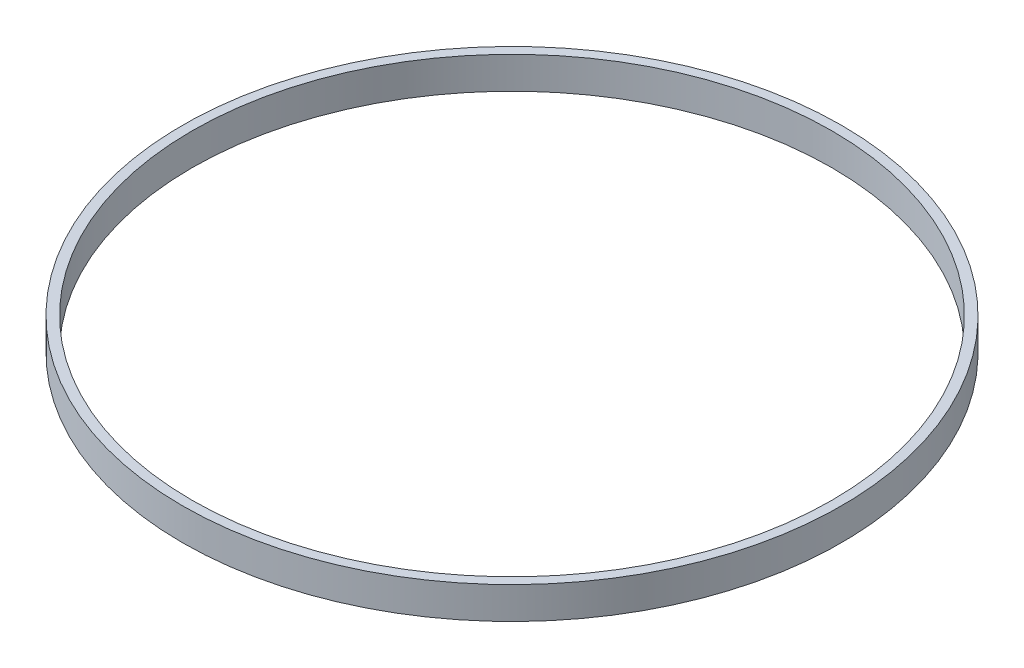
ISO-10303-21;
HEADER;
FILE_DESCRIPTION(('STEP AP214'),'2;1');
FILE_NAME('part.step','',(''),(''),'','','');
FILE_SCHEMA(('AUTOMOTIVE_DESIGN { 1 0 10303 214 1 1 1 1 }'));
ENDSEC;
DATA;
#1=APPLICATION_CONTEXT('core data for automotive mechanical design processes');
#2=APPLICATION_PROTOCOL_DEFINITION('international standard','automotive_design',2000,#1);
#3=PRODUCT_CONTEXT('',#1,'mechanical');
#4=PRODUCT('Part','Part','',(#3));
#5=PRODUCT_RELATED_PRODUCT_CATEGORY('part','',(#4));
#6=PRODUCT_DEFINITION_FORMATION('','',#4);
#7=PRODUCT_DEFINITION_CONTEXT('part definition',#1,'design');
#8=PRODUCT_DEFINITION('design','',#6,#7);
#9=PRODUCT_DEFINITION_SHAPE('','',#8);
#10=(LENGTH_UNIT() NAMED_UNIT(*) SI_UNIT(.MILLI.,.METRE.));
#11=(NAMED_UNIT(*) PLANE_ANGLE_UNIT() SI_UNIT($,.RADIAN.));
#12=(NAMED_UNIT(*) SI_UNIT($,.STERADIAN.) SOLID_ANGLE_UNIT());
#13=UNCERTAINTY_MEASURE_WITH_UNIT(LENGTH_MEASURE(1.E-05),#10,'distance_accuracy_value','');
#14=(GEOMETRIC_REPRESENTATION_CONTEXT(3) GLOBAL_UNCERTAINTY_ASSIGNED_CONTEXT((#13)) GLOBAL_UNIT_ASSIGNED_CONTEXT((#10,
#11,#12)) REPRESENTATION_CONTEXT('',''));
#15=CARTESIAN_POINT('',(0.,0.,0.));
#16=DIRECTION('',(0.,0.,1.));
#17=DIRECTION('',(1.,0.,0.));
#18=AXIS2_PLACEMENT_3D('',#15,#16,#17);
#19=CARTESIAN_POINT('',(0.,10.,0.));
#20=DIRECTION('',(0.,1.,0.));
#21=DIRECTION('',(0.,0.,1.));
#22=AXIS2_PLACEMENT_3D('',#19,#20,#21);
#23=PLANE('',#22);
#24=CARTESIAN_POINT('',(0.,10.,0.));
#25=DIRECTION('',(0.,1.,0.));
#26=DIRECTION('',(0.,0.,1.));
#27=AXIS2_PLACEMENT_3D('',#24,#25,#26);
#28=CIRCLE('',#27,103.);
#29=CARTESIAN_POINT('',(0.,10.,103.));
#30=VERTEX_POINT('',#29);
#31=EDGE_CURVE('E10',#30,#30,#28,.T.);
#32=ORIENTED_EDGE('',*,*,#31,.T.);
#33=EDGE_LOOP('',(#32));
#34=FACE_BOUND('',#33,.T.);
#35=CARTESIAN_POINT('',(0.,10.,0.));
#36=DIRECTION('',(0.,1.,0.));
#37=DIRECTION('',(0.,0.,1.));
#38=AXIS2_PLACEMENT_3D('',#35,#36,#37);
#39=CIRCLE('',#38,100.);
#40=CARTESIAN_POINT('',(0.,10.,100.));
#41=VERTEX_POINT('',#40);
#42=EDGE_CURVE('E42',#41,#41,#39,.T.);
#43=ORIENTED_EDGE('',*,*,#42,.F.);
#44=EDGE_LOOP('',(#43));
#45=FACE_BOUND('',#44,.T.);
#46=ADVANCED_FACE('F31',(#34,#45),#23,.T.);
#47=CARTESIAN_POINT('',(0.,0.,0.));
#48=DIRECTION('',(0.,1.,0.));
#49=DIRECTION('',(0.,0.,1.));
#50=AXIS2_PLACEMENT_3D('',#47,#48,#49);
#51=PLANE('',#50);
#52=CARTESIAN_POINT('',(0.,0.,0.));
#53=DIRECTION('',(0.,1.,0.));
#54=DIRECTION('',(0.,0.,1.));
#55=AXIS2_PLACEMENT_3D('',#52,#53,#54);
#56=CIRCLE('',#55,103.);
#57=CARTESIAN_POINT('',(0.,0.,103.));
#58=VERTEX_POINT('',#57);
#59=EDGE_CURVE('E35',#58,#58,#56,.T.);
#60=ORIENTED_EDGE('',*,*,#59,.F.);
#61=EDGE_LOOP('',(#60));
#62=FACE_BOUND('',#61,.T.);
#63=CARTESIAN_POINT('',(0.,0.,0.));
#64=DIRECTION('',(0.,1.,0.));
#65=DIRECTION('',(0.,0.,1.));
#66=AXIS2_PLACEMENT_3D('',#63,#64,#65);
#67=CIRCLE('',#66,100.);
#68=CARTESIAN_POINT('',(0.,0.,100.));
#69=VERTEX_POINT('',#68);
#70=EDGE_CURVE('E44',#69,#69,#67,.T.);
#71=ORIENTED_EDGE('',*,*,#70,.T.);
#72=EDGE_LOOP('',(#71));
#73=FACE_BOUND('',#72,.T.);
#74=ADVANCED_FACE('F54',(#62,#73),#51,.F.);
#75=CARTESIAN_POINT('',(0.,10.,0.));
#76=DIRECTION('',(0.,-1.,0.));
#77=DIRECTION('',(0.,0.,-1.));
#78=AXIS2_PLACEMENT_3D('',#75,#76,#77);
#79=CYLINDRICAL_SURFACE('',#78,103.);
#80=ORIENTED_EDGE('',*,*,#31,.F.);
#81=EDGE_LOOP('',(#80));
#82=FACE_BOUND('',#81,.T.);
#83=ORIENTED_EDGE('',*,*,#59,.T.);
#84=EDGE_LOOP('',(#83));
#85=FACE_BOUND('',#84,.T.);
#86=ADVANCED_FACE('F33',(#82,#85),#79,.T.);
#87=CARTESIAN_POINT('',(0.,10.,0.));
#88=DIRECTION('',(0.,-1.,0.));
#89=DIRECTION('',(0.,0.,-1.));
#90=AXIS2_PLACEMENT_3D('',#87,#88,#89);
#91=CYLINDRICAL_SURFACE('',#90,100.);
#92=ORIENTED_EDGE('',*,*,#42,.T.);
#93=EDGE_LOOP('',(#92));
#94=FACE_BOUND('',#93,.T.);
#95=ORIENTED_EDGE('',*,*,#70,.F.);
#96=EDGE_LOOP('',(#95));
#97=FACE_BOUND('',#96,.T.);
#98=ADVANCED_FACE('F50',(#94,#97),#91,.F.);
#99=CLOSED_SHELL('',(#46,#74,#86,#98));
#100=MANIFOLD_SOLID_BREP('B2',#99);
#101=ADVANCED_BREP_SHAPE_REPRESENTATION('',(#18,#100),#14);
#102=SHAPE_DEFINITION_REPRESENTATION(#9,#101);
ENDSEC;
END-ISO-10303-21;
